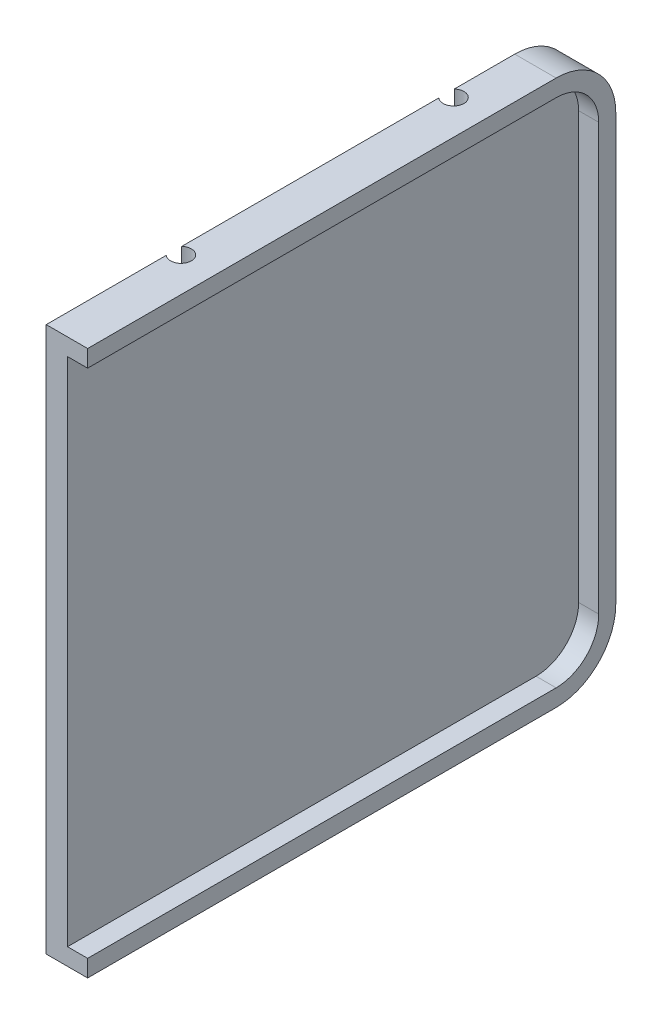
ISO-10303-21;
HEADER;
FILE_DESCRIPTION(('STEP AP214'),'2;1');
FILE_NAME('part.step','',(''),(''),'','','');
FILE_SCHEMA(('AUTOMOTIVE_DESIGN { 1 0 10303 214 1 1 1 1 }'));
ENDSEC;
DATA;
#1=APPLICATION_CONTEXT('core data for automotive mechanical design processes');
#2=APPLICATION_PROTOCOL_DEFINITION('international standard','automotive_design',2000,#1);
#3=PRODUCT_CONTEXT('',#1,'mechanical');
#4=PRODUCT('Part','Part','',(#3));
#5=PRODUCT_RELATED_PRODUCT_CATEGORY('part','',(#4));
#6=PRODUCT_DEFINITION_FORMATION('','',#4);
#7=PRODUCT_DEFINITION_CONTEXT('part definition',#1,'design');
#8=PRODUCT_DEFINITION('design','',#6,#7);
#9=PRODUCT_DEFINITION_SHAPE('','',#8);
#10=(LENGTH_UNIT() NAMED_UNIT(*) SI_UNIT(.MILLI.,.METRE.));
#11=(NAMED_UNIT(*) PLANE_ANGLE_UNIT() SI_UNIT($,.RADIAN.));
#12=(NAMED_UNIT(*) SI_UNIT($,.STERADIAN.) SOLID_ANGLE_UNIT());
#13=UNCERTAINTY_MEASURE_WITH_UNIT(LENGTH_MEASURE(1.E-05),#10,'distance_accuracy_value','');
#14=(GEOMETRIC_REPRESENTATION_CONTEXT(3) GLOBAL_UNCERTAINTY_ASSIGNED_CONTEXT((#13)) GLOBAL_UNIT_ASSIGNED_CONTEXT((#10,
#11,#12)) REPRESENTATION_CONTEXT('',''));
#15=CARTESIAN_POINT('',(0.,0.,0.));
#16=DIRECTION('',(0.,0.,1.));
#17=DIRECTION('',(1.,0.,0.));
#18=AXIS2_PLACEMENT_3D('',#15,#16,#17);
#19=CARTESIAN_POINT('',(31.9278,31.75,-184.15));
#20=DIRECTION('',(1.,0.,0.));
#21=DIRECTION('',(0.,0.,-1.));
#22=AXIS2_PLACEMENT_3D('',#19,#20,#21);
#23=PLANE('',#22);
#24=CARTESIAN_POINT('',(31.9278,-33.075,-186.69));
#25=DIRECTION('',(1.,0.,0.));
#26=DIRECTION('',(0.,0.,-1.));
#27=AXIS2_PLACEMENT_3D('',#24,#25,#26);
#28=CIRCLE('',#27,2.5);
#29=CARTESIAN_POINT('',(31.9278,-33.075,-189.19));
#30=VERTEX_POINT('',#29);
#31=EDGE_CURVE('E11',#30,#30,#28,.F.);
#32=ORIENTED_EDGE('',*,*,#31,.F.);
#33=EDGE_LOOP('',(#32));
#34=FACE_BOUND('',#33,.T.);
#35=CARTESIAN_POINT('',(31.9278,33.075,-186.69));
#36=DIRECTION('',(1.,0.,0.));
#37=DIRECTION('',(0.,0.,-1.));
#38=AXIS2_PLACEMENT_3D('',#35,#36,#37);
#39=CIRCLE('',#38,2.5);
#40=CARTESIAN_POINT('',(31.9278,33.075,-189.19));
#41=VERTEX_POINT('',#40);
#42=EDGE_CURVE('E61',#41,#41,#39,.F.);
#43=ORIENTED_EDGE('',*,*,#42,.F.);
#44=EDGE_LOOP('',(#43));
#45=FACE_BOUND('',#44,.T.);
#46=DIRECTION('',(0.,0.,1.));
#47=VECTOR('',#46,1.);
#48=CARTESIAN_POINT('',(31.9278,-40.64,-184.15));
#49=LINE('',#48,#47);
#50=CARTESIAN_POINT('',(31.9278,-40.64,-184.15));
#51=VERTEX_POINT('',#50);
#52=CARTESIAN_POINT('',(31.9278,-40.64,-175.137491176437));
#53=VERTEX_POINT('',#52);
#54=EDGE_CURVE('E189',#51,#53,#49,.T.);
#55=ORIENTED_EDGE('',*,*,#54,.T.);
#56=DIRECTION('',(0.,1.,0.));
#57=VECTOR('',#56,1.);
#58=CARTESIAN_POINT('',(31.9278,-40.64,-175.137491176437));
#59=LINE('',#58,#57);
#60=CARTESIAN_POINT('',(31.9278,40.64,-175.137491176437));
#61=VERTEX_POINT('',#60);
#62=EDGE_CURVE('E250',#53,#61,#59,.T.);
#63=ORIENTED_EDGE('',*,*,#62,.T.);
#64=DIRECTION('',(0.,0.,1.));
#65=VECTOR('',#64,1.);
#66=CARTESIAN_POINT('',(31.9278,40.64,-114.3));
#67=LINE('',#66,#65);
#68=CARTESIAN_POINT('',(31.9278,40.64,-184.15));
#69=VERTEX_POINT('',#68);
#70=EDGE_CURVE('E196',#61,#69,#67,.F.);
#71=ORIENTED_EDGE('',*,*,#70,.T.);
#72=CARTESIAN_POINT('',(31.9278,31.75,-184.15));
#73=DIRECTION('',(-1.,0.,0.));
#74=DIRECTION('',(0.,0.,1.));
#75=AXIS2_PLACEMENT_3D('',#72,#73,#74);
#76=CIRCLE('',#75,8.89000000000005);
#77=CARTESIAN_POINT('',(31.9278,31.75,-193.04));
#78=VERTEX_POINT('',#77);
#79=EDGE_CURVE('E413',#69,#78,#76,.T.);
#80=ORIENTED_EDGE('',*,*,#79,.T.);
#81=DIRECTION('',(0.,1.,0.));
#82=VECTOR('',#81,1.);
#83=CARTESIAN_POINT('',(31.9278,31.75,-193.04));
#84=LINE('',#83,#82);
#85=CARTESIAN_POINT('',(31.9278,-31.75,-193.04));
#86=VERTEX_POINT('',#85);
#87=EDGE_CURVE('E411',#78,#86,#84,.F.);
#88=ORIENTED_EDGE('',*,*,#87,.T.);
#89=CARTESIAN_POINT('',(31.9278,-31.75,-184.15));
#90=DIRECTION('',(-1.,0.,0.));
#91=DIRECTION('',(0.,0.,1.));
#92=AXIS2_PLACEMENT_3D('',#89,#90,#91);
#93=CIRCLE('',#92,8.89000000000005);
#94=EDGE_CURVE('E228',#86,#51,#93,.T.);
#95=ORIENTED_EDGE('',*,*,#94,.T.);
#96=EDGE_LOOP('',(#55,#63,#71,#80,#88,#95));
#97=FACE_BOUND('',#96,.T.);
#98=ADVANCED_FACE('F51',(#34,#45,#97),#23,.F.);
#99=CARTESIAN_POINT('',(31.9278,40.64,-134.497491176437));
#100=VERTEX_POINT('',#99);
#101=CARTESIAN_POINT('',(31.9278,40.64,-172.842508823563));
#102=VERTEX_POINT('',#101);
#103=EDGE_CURVE('E421',#100,#102,#67,.F.);
#104=ORIENTED_EDGE('',*,*,#103,.T.);
#105=DIRECTION('',(0.,1.,0.));
#106=VECTOR('',#105,1.);
#107=CARTESIAN_POINT('',(31.9278,-40.64,-172.842508823563));
#108=LINE('',#107,#106);
#109=CARTESIAN_POINT('',(31.9278,-40.64,-172.842508823563));
#110=VERTEX_POINT('',#109);
#111=EDGE_CURVE('E68',#102,#110,#108,.F.);
#112=ORIENTED_EDGE('',*,*,#111,.T.);
#113=CARTESIAN_POINT('',(31.9278,-40.64,-134.497491176437));
#114=VERTEX_POINT('',#113);
#115=EDGE_CURVE('E180',#110,#114,#49,.T.);
#116=ORIENTED_EDGE('',*,*,#115,.T.);
#117=DIRECTION('',(0.,1.,0.));
#118=VECTOR('',#117,1.);
#119=CARTESIAN_POINT('',(31.9278,-40.64,-134.497491176437));
#120=LINE('',#119,#118);
#121=EDGE_CURVE('E164',#114,#100,#120,.T.);
#122=ORIENTED_EDGE('',*,*,#121,.T.);
#123=EDGE_LOOP('',(#104,#112,#116,#122));
#124=FACE_BOUND('',#123,.T.);
#125=ADVANCED_FACE('F187',(#124),#23,.F.);
#126=CARTESIAN_POINT('',(31.9278,38.1,-114.3));
#127=DIRECTION('',(0.,0.,1.));
#128=DIRECTION('',(0.,-1.,0.));
#129=AXIS2_PLACEMENT_3D('',#126,#127,#128);
#130=PLANE('',#129);
#131=DIRECTION('',(0.,-1.,0.));
#132=VECTOR('',#131,1.);
#133=CARTESIAN_POINT('',(35.1028,38.1,-114.3));
#134=LINE('',#133,#132);
#135=CARTESIAN_POINT('',(35.1028,38.1,-114.3));
#136=VERTEX_POINT('',#135);
#137=CARTESIAN_POINT('',(35.1028,-38.1,-114.3));
#138=VERTEX_POINT('',#137);
#139=EDGE_CURVE('E297',#136,#138,#134,.T.);
#140=ORIENTED_EDGE('',*,*,#139,.F.);
#141=DIRECTION('',(-1.,0.,0.));
#142=VECTOR('',#141,1.);
#143=CARTESIAN_POINT('',(151.265480602523,38.1,-114.3));
#144=LINE('',#143,#142);
#145=CARTESIAN_POINT('',(38.1,38.1,-114.3));
#146=VERTEX_POINT('',#145);
#147=EDGE_CURVE('E268',#146,#136,#144,.T.);
#148=ORIENTED_EDGE('',*,*,#147,.F.);
#149=DIRECTION('',(0.,-1.,0.));
#150=VECTOR('',#149,1.);
#151=CARTESIAN_POINT('',(38.1,40.64,-114.3));
#152=LINE('',#151,#150);
#153=CARTESIAN_POINT('',(38.1,40.64,-114.3));
#154=VERTEX_POINT('',#153);
#155=EDGE_CURVE('E224',#154,#146,#152,.T.);
#156=ORIENTED_EDGE('',*,*,#155,.F.);
#157=DIRECTION('',(-1.,0.,0.));
#158=VECTOR('',#157,1.);
#159=CARTESIAN_POINT('',(151.265480602523,40.64,-114.3));
#160=LINE('',#159,#158);
#161=CARTESIAN_POINT('',(31.9278,40.64,-114.3));
#162=VERTEX_POINT('',#161);
#163=EDGE_CURVE('E264',#154,#162,#160,.T.);
#164=ORIENTED_EDGE('',*,*,#163,.T.);
#165=DIRECTION('',(0.,-1.,0.));
#166=VECTOR('',#165,1.);
#167=CARTESIAN_POINT('',(31.9278,38.1,-114.3));
#168=LINE('',#167,#166);
#169=CARTESIAN_POINT('',(31.9278,-40.64,-114.3));
#170=VERTEX_POINT('',#169);
#171=EDGE_CURVE('E293',#162,#170,#168,.T.);
#172=ORIENTED_EDGE('',*,*,#171,.T.);
#173=DIRECTION('',(-1.,0.,0.));
#174=VECTOR('',#173,1.);
#175=CARTESIAN_POINT('',(151.265480602523,-40.64,-114.3));
#176=LINE('',#175,#174);
#177=CARTESIAN_POINT('',(38.1,-40.64,-114.3));
#178=VERTEX_POINT('',#177);
#179=EDGE_CURVE('E245',#178,#170,#176,.T.);
#180=ORIENTED_EDGE('',*,*,#179,.F.);
#181=DIRECTION('',(0.,-1.,0.));
#182=VECTOR('',#181,1.);
#183=CARTESIAN_POINT('',(38.1,-38.1,-114.3));
#184=LINE('',#183,#182);
#185=CARTESIAN_POINT('',(38.1,-38.1,-114.3));
#186=VERTEX_POINT('',#185);
#187=EDGE_CURVE('E207',#186,#178,#184,.T.);
#188=ORIENTED_EDGE('',*,*,#187,.F.);
#189=DIRECTION('',(-1.,0.,0.));
#190=VECTOR('',#189,1.);
#191=CARTESIAN_POINT('',(151.265480602523,-38.1,-114.3));
#192=LINE('',#191,#190);
#193=EDGE_CURVE('E198',#186,#138,#192,.T.);
#194=ORIENTED_EDGE('',*,*,#193,.T.);
#195=EDGE_LOOP('',(#140,#148,#156,#164,#172,#180,#188,#194));
#196=FACE_BOUND('',#195,.T.);
#197=ADVANCED_FACE('F449',(#196),#130,.T.);
#198=CARTESIAN_POINT('',(31.9278,-33.075,-120.65));
#199=DIRECTION('',(1.,0.,0.));
#200=DIRECTION('',(0.,0.,-1.));
#201=AXIS2_PLACEMENT_3D('',#198,#199,#200);
#202=CIRCLE('',#201,2.50000000000001);
#203=CARTESIAN_POINT('',(31.9278,-33.075,-123.15));
#204=VERTEX_POINT('',#203);
#205=EDGE_CURVE('E373',#204,#204,#202,.F.);
#206=ORIENTED_EDGE('',*,*,#205,.F.);
#207=EDGE_LOOP('',(#206));
#208=FACE_BOUND('',#207,.T.);
#209=CARTESIAN_POINT('',(31.9278,33.075,-120.65));
#210=DIRECTION('',(1.,0.,0.));
#211=DIRECTION('',(0.,0.,-1.));
#212=AXIS2_PLACEMENT_3D('',#209,#210,#211);
#213=CIRCLE('',#212,2.5);
#214=CARTESIAN_POINT('',(31.9278,33.075,-123.15));
#215=VERTEX_POINT('',#214);
#216=EDGE_CURVE('E353',#215,#215,#213,.F.);
#217=ORIENTED_EDGE('',*,*,#216,.F.);
#218=EDGE_LOOP('',(#217));
#219=FACE_BOUND('',#218,.T.);
#220=CARTESIAN_POINT('',(31.9278,40.64,-132.202508823563));
#221=VERTEX_POINT('',#220);
#222=EDGE_CURVE('E201',#162,#221,#67,.F.);
#223=ORIENTED_EDGE('',*,*,#222,.T.);
#224=DIRECTION('',(0.,1.,0.));
#225=VECTOR('',#224,1.);
#226=CARTESIAN_POINT('',(31.9278,-40.64,-132.202508823563));
#227=LINE('',#226,#225);
#228=CARTESIAN_POINT('',(31.9278,-40.64,-132.202508823563));
#229=VERTEX_POINT('',#228);
#230=EDGE_CURVE('E76',#221,#229,#227,.F.);
#231=ORIENTED_EDGE('',*,*,#230,.T.);
#232=EDGE_CURVE('E182',#229,#170,#49,.T.);
#233=ORIENTED_EDGE('',*,*,#232,.T.);
#234=ORIENTED_EDGE('',*,*,#171,.F.);
#235=EDGE_LOOP('',(#223,#231,#233,#234));
#236=FACE_BOUND('',#235,.T.);
#237=ADVANCED_FACE('F388',(#208,#219,#236),#23,.F.);
#238=CARTESIAN_POINT('',(35.1028,31.75,-184.15));
#239=DIRECTION('',(1.,0.,0.));
#240=DIRECTION('',(0.,0.,-1.));
#241=AXIS2_PLACEMENT_3D('',#238,#239,#240);
#242=PLANE('',#241);
#243=DIRECTION('',(0.,0.,-1.));
#244=VECTOR('',#243,1.);
#245=CARTESIAN_POINT('',(35.1028,38.1,-114.3));
#246=LINE('',#245,#244);
#247=CARTESIAN_POINT('',(35.1028,38.1,-184.15));
#248=VERTEX_POINT('',#247);
#249=EDGE_CURVE('E254',#136,#248,#246,.T.);
#250=ORIENTED_EDGE('',*,*,#249,.F.);
#251=ORIENTED_EDGE('',*,*,#139,.T.);
#252=DIRECTION('',(0.,0.,1.));
#253=VECTOR('',#252,1.);
#254=CARTESIAN_POINT('',(35.1028,-38.1,-184.15));
#255=LINE('',#254,#253);
#256=CARTESIAN_POINT('',(35.1028,-38.1,-184.15));
#257=VERTEX_POINT('',#256);
#258=EDGE_CURVE('E311',#257,#138,#255,.T.);
#259=ORIENTED_EDGE('',*,*,#258,.F.);
#260=CARTESIAN_POINT('',(35.1028,-31.75,-184.15));
#261=DIRECTION('',(-1.,0.,0.));
#262=DIRECTION('',(0.,0.,1.));
#263=AXIS2_PLACEMENT_3D('',#260,#261,#262);
#264=CIRCLE('',#263,6.35000000000004);
#265=CARTESIAN_POINT('',(35.1028,-31.75,-190.5));
#266=VERTEX_POINT('',#265);
#267=EDGE_CURVE('E307',#266,#257,#264,.T.);
#268=ORIENTED_EDGE('',*,*,#267,.F.);
#269=DIRECTION('',(0.,-1.,0.));
#270=VECTOR('',#269,1.);
#271=CARTESIAN_POINT('',(35.1028,31.75,-190.5));
#272=LINE('',#271,#270);
#273=CARTESIAN_POINT('',(35.1028,31.75,-190.5));
#274=VERTEX_POINT('',#273);
#275=EDGE_CURVE('E303',#274,#266,#272,.T.);
#276=ORIENTED_EDGE('',*,*,#275,.F.);
#277=CARTESIAN_POINT('',(35.1028,31.75,-184.15));
#278=DIRECTION('',(1.,0.,0.));
#279=DIRECTION('',(0.,0.,-1.));
#280=AXIS2_PLACEMENT_3D('',#277,#278,#279);
#281=CIRCLE('',#280,6.35000000000005);
#282=EDGE_CURVE('E300',#274,#248,#281,.T.);
#283=ORIENTED_EDGE('',*,*,#282,.T.);
#284=EDGE_LOOP('',(#250,#251,#259,#268,#276,#283));
#285=FACE_BOUND('',#284,.T.);
#286=ADVANCED_FACE('F451',(#285),#242,.T.);
#287=CARTESIAN_POINT('',(151.265480602523,-40.64,-184.15));
#288=DIRECTION('',(0.,-1.,0.));
#289=DIRECTION('',(0.,0.,-1.));
#290=AXIS2_PLACEMENT_3D('',#287,#288,#289);
#291=PLANE('',#290);
#292=CARTESIAN_POINT('',(32.9698,-40.64,-173.99));
#293=DIRECTION('',(0.,1.,0.));
#294=DIRECTION('',(0.,0.,1.));
#295=AXIS2_PLACEMENT_3D('',#292,#293,#294);
#296=CIRCLE('',#295,1.55);
#297=EDGE_CURVE('E184',#110,#53,#296,.T.);
#298=ORIENTED_EDGE('',*,*,#297,.T.);
#299=ORIENTED_EDGE('',*,*,#54,.F.);
#300=DIRECTION('',(-1.,0.,0.));
#301=VECTOR('',#300,1.);
#302=CARTESIAN_POINT('',(151.265480602523,-40.64,-184.15));
#303=LINE('',#302,#301);
#304=CARTESIAN_POINT('',(38.1,-40.64,-184.15));
#305=VERTEX_POINT('',#304);
#306=EDGE_CURVE('E241',#305,#51,#303,.T.);
#307=ORIENTED_EDGE('',*,*,#306,.F.);
#308=DIRECTION('',(0.,0.,1.));
#309=VECTOR('',#308,1.);
#310=CARTESIAN_POINT('',(38.1,-40.64,-184.15));
#311=LINE('',#310,#309);
#312=EDGE_CURVE('E246',#305,#178,#311,.T.);
#313=ORIENTED_EDGE('',*,*,#312,.T.);
#314=ORIENTED_EDGE('',*,*,#179,.T.);
#315=ORIENTED_EDGE('',*,*,#232,.F.);
#316=CARTESIAN_POINT('',(32.9698,-40.64,-133.35));
#317=DIRECTION('',(0.,1.,0.));
#318=DIRECTION('',(0.,0.,1.));
#319=AXIS2_PLACEMENT_3D('',#316,#317,#318);
#320=CIRCLE('',#319,1.55);
#321=EDGE_CURVE('E167',#229,#114,#320,.T.);
#322=ORIENTED_EDGE('',*,*,#321,.T.);
#323=ORIENTED_EDGE('',*,*,#115,.F.);
#324=EDGE_LOOP('',(#298,#299,#307,#313,#314,#315,#322,#323));
#325=FACE_BOUND('',#324,.T.);
#326=ADVANCED_FACE('F179',(#325),#291,.T.);
#327=CARTESIAN_POINT('',(151.265480602523,-31.75,-184.15));
#328=DIRECTION('',(-1.,0.,0.));
#329=DIRECTION('',(0.,0.,1.));
#330=AXIS2_PLACEMENT_3D('',#327,#328,#329);
#331=CYLINDRICAL_SURFACE('',#330,8.89000000000005);
#332=DIRECTION('',(-1.,0.,0.));
#333=VECTOR('',#332,1.);
#334=CARTESIAN_POINT('',(151.265480602523,-31.75,-193.04));
#335=LINE('',#334,#333);
#336=CARTESIAN_POINT('',(38.1,-31.75,-193.04));
#337=VERTEX_POINT('',#336);
#338=EDGE_CURVE('E237',#337,#86,#335,.T.);
#339=ORIENTED_EDGE('',*,*,#338,.F.);
#340=CARTESIAN_POINT('',(38.1,-31.75,-184.15));
#341=DIRECTION('',(1.,0.,0.));
#342=DIRECTION('',(0.,0.,-1.));
#343=AXIS2_PLACEMENT_3D('',#340,#341,#342);
#344=CIRCLE('',#343,8.89000000000005);
#345=EDGE_CURVE('E242',#337,#305,#344,.F.);
#346=ORIENTED_EDGE('',*,*,#345,.T.);
#347=ORIENTED_EDGE('',*,*,#306,.T.);
#348=ORIENTED_EDGE('',*,*,#94,.F.);
#349=EDGE_LOOP('',(#339,#346,#347,#348));
#350=FACE_BOUND('',#349,.T.);
#351=ADVANCED_FACE('F442',(#350),#331,.T.);
#352=CARTESIAN_POINT('',(151.265480602523,31.75,-193.04));
#353=DIRECTION('',(0.,0.,-1.));
#354=DIRECTION('',(-1.,0.,0.));
#355=AXIS2_PLACEMENT_3D('',#352,#353,#354);
#356=PLANE('',#355);
#357=DIRECTION('',(-1.,0.,0.));
#358=VECTOR('',#357,1.);
#359=CARTESIAN_POINT('',(151.265480602523,31.75,-193.04));
#360=LINE('',#359,#358);
#361=CARTESIAN_POINT('',(38.1,31.75,-193.04));
#362=VERTEX_POINT('',#361);
#363=EDGE_CURVE('E233',#362,#78,#360,.T.);
#364=ORIENTED_EDGE('',*,*,#363,.F.);
#365=DIRECTION('',(0.,-1.,0.));
#366=VECTOR('',#365,1.);
#367=CARTESIAN_POINT('',(38.1,31.75,-193.04));
#368=LINE('',#367,#366);
#369=EDGE_CURVE('E238',#362,#337,#368,.T.);
#370=ORIENTED_EDGE('',*,*,#369,.T.);
#371=ORIENTED_EDGE('',*,*,#338,.T.);
#372=ORIENTED_EDGE('',*,*,#87,.F.);
#373=EDGE_LOOP('',(#364,#370,#371,#372));
#374=FACE_BOUND('',#373,.T.);
#375=ADVANCED_FACE('F439',(#374),#356,.T.);
#376=CARTESIAN_POINT('',(151.265480602523,31.75,-184.15));
#377=DIRECTION('',(-1.,0.,0.));
#378=DIRECTION('',(0.,0.,1.));
#379=AXIS2_PLACEMENT_3D('',#376,#377,#378);
#380=CYLINDRICAL_SURFACE('',#379,8.89000000000005);
#381=DIRECTION('',(-1.,0.,0.));
#382=VECTOR('',#381,1.);
#383=CARTESIAN_POINT('',(151.265480602523,40.64,-184.15));
#384=LINE('',#383,#382);
#385=CARTESIAN_POINT('',(38.1,40.64,-184.15));
#386=VERTEX_POINT('',#385);
#387=EDGE_CURVE('E232',#386,#69,#384,.T.);
#388=ORIENTED_EDGE('',*,*,#387,.F.);
#389=CARTESIAN_POINT('',(38.1,31.75,-184.15));
#390=DIRECTION('',(1.,0.,0.));
#391=DIRECTION('',(0.,0.,-1.));
#392=AXIS2_PLACEMENT_3D('',#389,#390,#391);
#393=CIRCLE('',#392,8.89000000000005);
#394=EDGE_CURVE('E234',#386,#362,#393,.F.);
#395=ORIENTED_EDGE('',*,*,#394,.T.);
#396=ORIENTED_EDGE('',*,*,#363,.T.);
#397=ORIENTED_EDGE('',*,*,#79,.F.);
#398=EDGE_LOOP('',(#388,#395,#396,#397));
#399=FACE_BOUND('',#398,.T.);
#400=ADVANCED_FACE('F434',(#399),#380,.T.);
#401=CARTESIAN_POINT('',(151.265480602523,40.64,-114.3));
#402=DIRECTION('',(0.,1.,0.));
#403=DIRECTION('',(0.,0.,1.));
#404=AXIS2_PLACEMENT_3D('',#401,#402,#403);
#405=PLANE('',#404);
#406=CARTESIAN_POINT('',(32.9698,40.64,-173.99));
#407=DIRECTION('',(0.,1.,0.));
#408=DIRECTION('',(0.,0.,1.));
#409=AXIS2_PLACEMENT_3D('',#406,#407,#408);
#410=CIRCLE('',#409,1.55);
#411=EDGE_CURVE('E319',#102,#61,#410,.T.);
#412=ORIENTED_EDGE('',*,*,#411,.F.);
#413=ORIENTED_EDGE('',*,*,#103,.F.);
#414=CARTESIAN_POINT('',(32.9698,40.64,-133.35));
#415=DIRECTION('',(0.,1.,0.));
#416=DIRECTION('',(0.,0.,1.));
#417=AXIS2_PLACEMENT_3D('',#414,#415,#416);
#418=CIRCLE('',#417,1.55);
#419=EDGE_CURVE('E168',#221,#100,#418,.T.);
#420=ORIENTED_EDGE('',*,*,#419,.F.);
#421=ORIENTED_EDGE('',*,*,#222,.F.);
#422=ORIENTED_EDGE('',*,*,#163,.F.);
#423=DIRECTION('',(0.,0.,-1.));
#424=VECTOR('',#423,1.);
#425=CARTESIAN_POINT('',(38.1,40.64,-114.3));
#426=LINE('',#425,#424);
#427=EDGE_CURVE('E229',#154,#386,#426,.T.);
#428=ORIENTED_EDGE('',*,*,#427,.T.);
#429=ORIENTED_EDGE('',*,*,#387,.T.);
#430=ORIENTED_EDGE('',*,*,#70,.F.);
#431=EDGE_LOOP('',(#412,#413,#420,#421,#422,#428,#429,#430));
#432=FACE_BOUND('',#431,.T.);
#433=ADVANCED_FACE('F429',(#432),#405,.T.);
#434=CARTESIAN_POINT('',(151.265480602523,38.1,-114.3));
#435=DIRECTION('',(0.,1.,0.));
#436=DIRECTION('',(0.,0.,1.));
#437=AXIS2_PLACEMENT_3D('',#434,#435,#436);
#438=PLANE('',#437);
#439=ORIENTED_EDGE('',*,*,#249,.T.);
#440=DIRECTION('',(-1.,0.,0.));
#441=VECTOR('',#440,1.);
#442=CARTESIAN_POINT('',(151.265480602523,38.1,-184.15));
#443=LINE('',#442,#441);
#444=CARTESIAN_POINT('',(38.1,38.1,-184.15));
#445=VERTEX_POINT('',#444);
#446=EDGE_CURVE('E272',#445,#248,#443,.T.);
#447=ORIENTED_EDGE('',*,*,#446,.F.);
#448=DIRECTION('',(0.,0.,-1.));
#449=VECTOR('',#448,1.);
#450=CARTESIAN_POINT('',(38.1,38.1,-114.3));
#451=LINE('',#450,#449);
#452=EDGE_CURVE('E220',#146,#445,#451,.T.);
#453=ORIENTED_EDGE('',*,*,#452,.F.);
#454=ORIENTED_EDGE('',*,*,#147,.T.);
#455=EDGE_LOOP('',(#439,#447,#453,#454));
#456=FACE_BOUND('',#455,.T.);
#457=ADVANCED_FACE('F512',(#456),#438,.F.);
#458=CARTESIAN_POINT('',(151.265480602523,31.75,-184.15));
#459=DIRECTION('',(-1.,0.,0.));
#460=DIRECTION('',(0.,0.,1.));
#461=AXIS2_PLACEMENT_3D('',#458,#459,#460);
#462=CYLINDRICAL_SURFACE('',#461,6.35000000000005);
#463=ORIENTED_EDGE('',*,*,#282,.F.);
#464=DIRECTION('',(-1.,0.,0.));
#465=VECTOR('',#464,1.);
#466=CARTESIAN_POINT('',(151.265480602523,31.75,-190.5));
#467=LINE('',#466,#465);
#468=CARTESIAN_POINT('',(38.1,31.75,-190.5));
#469=VERTEX_POINT('',#468);
#470=EDGE_CURVE('E276',#469,#274,#467,.T.);
#471=ORIENTED_EDGE('',*,*,#470,.F.);
#472=CARTESIAN_POINT('',(38.1,31.75,-184.15));
#473=DIRECTION('',(1.,0.,0.));
#474=DIRECTION('',(0.,0.,-1.));
#475=AXIS2_PLACEMENT_3D('',#472,#473,#474);
#476=CIRCLE('',#475,6.35000000000005);
#477=EDGE_CURVE('E216',#445,#469,#476,.F.);
#478=ORIENTED_EDGE('',*,*,#477,.F.);
#479=ORIENTED_EDGE('',*,*,#446,.T.);
#480=EDGE_LOOP('',(#463,#471,#478,#479));
#481=FACE_BOUND('',#480,.T.);
#482=ADVANCED_FACE('F517',(#481),#462,.F.);
#483=CARTESIAN_POINT('',(151.265480602523,31.75,-190.5));
#484=DIRECTION('',(0.,0.,-1.));
#485=DIRECTION('',(-1.,0.,0.));
#486=AXIS2_PLACEMENT_3D('',#483,#484,#485);
#487=PLANE('',#486);
#488=ORIENTED_EDGE('',*,*,#275,.T.);
#489=DIRECTION('',(-1.,0.,0.));
#490=VECTOR('',#489,1.);
#491=CARTESIAN_POINT('',(151.265480602523,-31.75,-190.5));
#492=LINE('',#491,#490);
#493=CARTESIAN_POINT('',(38.1,-31.75,-190.5));
#494=VERTEX_POINT('',#493);
#495=EDGE_CURVE('E280',#494,#266,#492,.T.);
#496=ORIENTED_EDGE('',*,*,#495,.F.);
#497=DIRECTION('',(0.,-1.,0.));
#498=VECTOR('',#497,1.);
#499=CARTESIAN_POINT('',(38.1,31.75,-190.5));
#500=LINE('',#499,#498);
#501=EDGE_CURVE('E212',#469,#494,#500,.T.);
#502=ORIENTED_EDGE('',*,*,#501,.F.);
#503=ORIENTED_EDGE('',*,*,#470,.T.);
#504=EDGE_LOOP('',(#488,#496,#502,#503));
#505=FACE_BOUND('',#504,.T.);
#506=ADVANCED_FACE('F527',(#505),#487,.F.);
#507=CARTESIAN_POINT('',(151.265480602523,-31.75,-184.15));
#508=DIRECTION('',(-1.,0.,0.));
#509=DIRECTION('',(0.,0.,1.));
#510=AXIS2_PLACEMENT_3D('',#507,#508,#509);
#511=CYLINDRICAL_SURFACE('',#510,6.35000000000005);
#512=ORIENTED_EDGE('',*,*,#267,.T.);
#513=DIRECTION('',(-1.,0.,0.));
#514=VECTOR('',#513,1.);
#515=CARTESIAN_POINT('',(151.265480602523,-38.1,-184.15));
#516=LINE('',#515,#514);
#517=CARTESIAN_POINT('',(38.1,-38.1,-184.15));
#518=VERTEX_POINT('',#517);
#519=EDGE_CURVE('E284',#518,#257,#516,.T.);
#520=ORIENTED_EDGE('',*,*,#519,.F.);
#521=CARTESIAN_POINT('',(38.1,-31.75,-184.15));
#522=DIRECTION('',(1.,0.,0.));
#523=DIRECTION('',(0.,0.,-1.));
#524=AXIS2_PLACEMENT_3D('',#521,#522,#523);
#525=CIRCLE('',#524,6.35000000000005);
#526=EDGE_CURVE('E208',#494,#518,#525,.F.);
#527=ORIENTED_EDGE('',*,*,#526,.F.);
#528=ORIENTED_EDGE('',*,*,#495,.T.);
#529=EDGE_LOOP('',(#512,#520,#527,#528));
#530=FACE_BOUND('',#529,.T.);
#531=ADVANCED_FACE('F537',(#530),#511,.F.);
#532=CARTESIAN_POINT('',(151.265480602523,-38.1,-184.15));
#533=DIRECTION('',(0.,-1.,0.));
#534=DIRECTION('',(0.,0.,-1.));
#535=AXIS2_PLACEMENT_3D('',#532,#533,#534);
#536=PLANE('',#535);
#537=ORIENTED_EDGE('',*,*,#258,.T.);
#538=ORIENTED_EDGE('',*,*,#193,.F.);
#539=DIRECTION('',(0.,0.,1.));
#540=VECTOR('',#539,1.);
#541=CARTESIAN_POINT('',(38.1,-38.1,-184.15));
#542=LINE('',#541,#540);
#543=EDGE_CURVE('E203',#518,#186,#542,.T.);
#544=ORIENTED_EDGE('',*,*,#543,.F.);
#545=ORIENTED_EDGE('',*,*,#519,.T.);
#546=EDGE_LOOP('',(#537,#538,#544,#545));
#547=FACE_BOUND('',#546,.T.);
#548=ADVANCED_FACE('F547',(#547),#536,.F.);
#549=CARTESIAN_POINT('',(38.1,-31.75,184.15));
#550=DIRECTION('',(1.,0.,0.));
#551=DIRECTION('',(0.,0.,-1.));
#552=AXIS2_PLACEMENT_3D('',#549,#550,#551);
#553=PLANE('',#552);
#554=ORIENTED_EDGE('',*,*,#312,.F.);
#555=ORIENTED_EDGE('',*,*,#345,.F.);
#556=ORIENTED_EDGE('',*,*,#369,.F.);
#557=ORIENTED_EDGE('',*,*,#394,.F.);
#558=ORIENTED_EDGE('',*,*,#427,.F.);
#559=ORIENTED_EDGE('',*,*,#155,.T.);
#560=ORIENTED_EDGE('',*,*,#452,.T.);
#561=ORIENTED_EDGE('',*,*,#477,.T.);
#562=ORIENTED_EDGE('',*,*,#501,.T.);
#563=ORIENTED_EDGE('',*,*,#526,.T.);
#564=ORIENTED_EDGE('',*,*,#543,.T.);
#565=ORIENTED_EDGE('',*,*,#187,.T.);
#566=EDGE_LOOP('',(#554,#555,#556,#557,#558,#559,#560,#561,#562,#563,#564,#565));
#567=FACE_BOUND('',#566,.T.);
#568=ADVANCED_FACE('F445',(#567),#553,.T.);
#569=CARTESIAN_POINT('',(32.9698,-40.64,-133.35));
#570=DIRECTION('',(0.,1.,0.));
#571=DIRECTION('',(0.,0.,1.));
#572=AXIS2_PLACEMENT_3D('',#569,#570,#571);
#573=CYLINDRICAL_SURFACE('',#572,1.55);
#574=ORIENTED_EDGE('',*,*,#321,.F.);
#575=ORIENTED_EDGE('',*,*,#230,.F.);
#576=ORIENTED_EDGE('',*,*,#419,.T.);
#577=ORIENTED_EDGE('',*,*,#121,.F.);
#578=EDGE_LOOP('',(#574,#575,#576,#577));
#579=FACE_BOUND('',#578,.T.);
#580=ADVANCED_FACE('F166',(#579),#573,.F.);
#581=CARTESIAN_POINT('',(32.9698,-40.64,-173.99));
#582=DIRECTION('',(0.,1.,0.));
#583=DIRECTION('',(0.,0.,1.));
#584=AXIS2_PLACEMENT_3D('',#581,#582,#583);
#585=CYLINDRICAL_SURFACE('',#584,1.55);
#586=ORIENTED_EDGE('',*,*,#297,.F.);
#587=ORIENTED_EDGE('',*,*,#111,.F.);
#588=ORIENTED_EDGE('',*,*,#411,.T.);
#589=ORIENTED_EDGE('',*,*,#62,.F.);
#590=EDGE_LOOP('',(#586,#587,#588,#589));
#591=FACE_BOUND('',#590,.T.);
#592=ADVANCED_FACE('F571',(#591),#585,.F.);
#593=CARTESIAN_POINT('',(31.6738,-33.075,-186.69));
#594=DIRECTION('',(1.,0.,0.));
#595=DIRECTION('',(0.,0.,-1.));
#596=AXIS2_PLACEMENT_3D('',#593,#594,#595);
#597=CYLINDRICAL_SURFACE('',#596,2.5);
#598=CARTESIAN_POINT('',(31.6738,-33.075,-186.69));
#599=DIRECTION('',(-1.,0.,0.));
#600=DIRECTION('',(0.,0.,1.));
#601=AXIS2_PLACEMENT_3D('',#598,#599,#600);
#602=CIRCLE('',#601,2.5);
#603=CARTESIAN_POINT('',(31.6738,-33.075,-184.19));
#604=VERTEX_POINT('',#603);
#605=EDGE_CURVE('E875',#604,#604,#602,.T.);
#606=ORIENTED_EDGE('',*,*,#605,.F.);
#607=EDGE_LOOP('',(#606));
#608=FACE_BOUND('',#607,.T.);
#609=ORIENTED_EDGE('',*,*,#31,.T.);
#610=EDGE_LOOP('',(#609));
#611=FACE_BOUND('',#610,.T.);
#612=ADVANCED_FACE('F578',(#608,#611),#597,.T.);
#613=CARTESIAN_POINT('',(31.6738,-33.075,-186.69));
#614=DIRECTION('',(-1.,0.,0.));
#615=DIRECTION('',(0.,0.,1.));
#616=AXIS2_PLACEMENT_3D('',#613,#614,#615);
#617=PLANE('',#616);
#618=CARTESIAN_POINT('',(31.6738,-33.075,-186.69));
#619=DIRECTION('',(-1.,0.,0.));
#620=DIRECTION('',(0.,0.,1.));
#621=AXIS2_PLACEMENT_3D('',#618,#619,#620);
#622=CIRCLE('',#621,1.47500000000001);
#623=CARTESIAN_POINT('',(31.6738,-33.075,-185.215));
#624=VERTEX_POINT('',#623);
#625=EDGE_CURVE('E354',#624,#624,#622,.T.);
#626=ORIENTED_EDGE('',*,*,#625,.F.);
#627=EDGE_LOOP('',(#626));
#628=FACE_BOUND('',#627,.T.);
#629=ORIENTED_EDGE('',*,*,#605,.T.);
#630=EDGE_LOOP('',(#629));
#631=FACE_BOUND('',#630,.T.);
#632=ADVANCED_FACE('F585',(#628,#631),#617,.T.);
#633=CARTESIAN_POINT('',(31.6738,-33.075,-120.65));
#634=DIRECTION('',(1.,0.,0.));
#635=DIRECTION('',(0.,0.,-1.));
#636=AXIS2_PLACEMENT_3D('',#633,#634,#635);
#637=CYLINDRICAL_SURFACE('',#636,2.50000000000001);
#638=CARTESIAN_POINT('',(31.6738,-33.075,-120.65));
#639=DIRECTION('',(-1.,0.,0.));
#640=DIRECTION('',(0.,0.,1.));
#641=AXIS2_PLACEMENT_3D('',#638,#639,#640);
#642=CIRCLE('',#641,2.50000000000001);
#643=CARTESIAN_POINT('',(31.6738,-33.075,-118.15));
#644=VERTEX_POINT('',#643);
#645=EDGE_CURVE('E867',#644,#644,#642,.T.);
#646=ORIENTED_EDGE('',*,*,#645,.F.);
#647=EDGE_LOOP('',(#646));
#648=FACE_BOUND('',#647,.T.);
#649=ORIENTED_EDGE('',*,*,#205,.T.);
#650=EDGE_LOOP('',(#649));
#651=FACE_BOUND('',#650,.T.);
#652=ADVANCED_FACE('F592',(#648,#651),#637,.T.);
#653=CARTESIAN_POINT('',(31.6738,-33.075,-120.65));
#654=DIRECTION('',(-1.,0.,0.));
#655=DIRECTION('',(0.,0.,1.));
#656=AXIS2_PLACEMENT_3D('',#653,#654,#655);
#657=PLANE('',#656);
#658=CARTESIAN_POINT('',(31.6738,-33.075,-120.65));
#659=DIRECTION('',(-1.,0.,0.));
#660=DIRECTION('',(0.,0.,1.));
#661=AXIS2_PLACEMENT_3D('',#658,#659,#660);
#662=CIRCLE('',#661,1.47499999999999);
#663=CARTESIAN_POINT('',(31.6738,-33.075,-119.175));
#664=VERTEX_POINT('',#663);
#665=EDGE_CURVE('E358',#664,#664,#662,.T.);
#666=ORIENTED_EDGE('',*,*,#665,.F.);
#667=EDGE_LOOP('',(#666));
#668=FACE_BOUND('',#667,.T.);
#669=ORIENTED_EDGE('',*,*,#645,.T.);
#670=EDGE_LOOP('',(#669));
#671=FACE_BOUND('',#670,.T.);
#672=ADVANCED_FACE('F599',(#668,#671),#657,.T.);
#673=CARTESIAN_POINT('',(31.6738,33.075,-120.65));
#674=DIRECTION('',(1.,0.,0.));
#675=DIRECTION('',(0.,0.,-1.));
#676=AXIS2_PLACEMENT_3D('',#673,#674,#675);
#677=CYLINDRICAL_SURFACE('',#676,2.5);
#678=CARTESIAN_POINT('',(31.6738,33.075,-120.65));
#679=DIRECTION('',(-1.,0.,0.));
#680=DIRECTION('',(0.,0.,1.));
#681=AXIS2_PLACEMENT_3D('',#678,#679,#680);
#682=CIRCLE('',#681,2.5);
#683=CARTESIAN_POINT('',(31.6738,33.075,-118.15));
#684=VERTEX_POINT('',#683);
#685=EDGE_CURVE('E864',#684,#684,#682,.T.);
#686=ORIENTED_EDGE('',*,*,#685,.F.);
#687=EDGE_LOOP('',(#686));
#688=FACE_BOUND('',#687,.T.);
#689=ORIENTED_EDGE('',*,*,#216,.T.);
#690=EDGE_LOOP('',(#689));
#691=FACE_BOUND('',#690,.T.);
#692=ADVANCED_FACE('F606',(#688,#691),#677,.T.);
#693=CARTESIAN_POINT('',(31.6738,33.075,-120.65));
#694=DIRECTION('',(-1.,0.,0.));
#695=DIRECTION('',(0.,0.,1.));
#696=AXIS2_PLACEMENT_3D('',#693,#694,#695);
#697=PLANE('',#696);
#698=CARTESIAN_POINT('',(31.6738,33.075,-120.65));
#699=DIRECTION('',(-1.,0.,0.));
#700=DIRECTION('',(0.,0.,1.));
#701=AXIS2_PLACEMENT_3D('',#698,#699,#700);
#702=CIRCLE('',#701,1.475);
#703=CARTESIAN_POINT('',(31.6738,33.075,-119.175));
#704=VERTEX_POINT('',#703);
#705=EDGE_CURVE('E363',#704,#704,#702,.T.);
#706=ORIENTED_EDGE('',*,*,#705,.F.);
#707=EDGE_LOOP('',(#706));
#708=FACE_BOUND('',#707,.T.);
#709=ORIENTED_EDGE('',*,*,#685,.T.);
#710=EDGE_LOOP('',(#709));
#711=FACE_BOUND('',#710,.T.);
#712=ADVANCED_FACE('F613',(#708,#711),#697,.T.);
#713=CARTESIAN_POINT('',(31.6738,33.075,-186.69));
#714=DIRECTION('',(1.,0.,0.));
#715=DIRECTION('',(0.,0.,-1.));
#716=AXIS2_PLACEMENT_3D('',#713,#714,#715);
#717=CYLINDRICAL_SURFACE('',#716,2.5);
#718=CARTESIAN_POINT('',(31.6738,33.075,-186.69));
#719=DIRECTION('',(-1.,0.,0.));
#720=DIRECTION('',(0.,0.,1.));
#721=AXIS2_PLACEMENT_3D('',#718,#719,#720);
#722=CIRCLE('',#721,2.5);
#723=CARTESIAN_POINT('',(31.6738,33.075,-184.19));
#724=VERTEX_POINT('',#723);
#725=EDGE_CURVE('E359',#724,#724,#722,.T.);
#726=ORIENTED_EDGE('',*,*,#725,.F.);
#727=EDGE_LOOP('',(#726));
#728=FACE_BOUND('',#727,.T.);
#729=ORIENTED_EDGE('',*,*,#42,.T.);
#730=EDGE_LOOP('',(#729));
#731=FACE_BOUND('',#730,.T.);
#732=ADVANCED_FACE('F382',(#728,#731),#717,.T.);
#733=CARTESIAN_POINT('',(31.6738,33.075,-186.69));
#734=DIRECTION('',(-1.,0.,0.));
#735=DIRECTION('',(0.,0.,1.));
#736=AXIS2_PLACEMENT_3D('',#733,#734,#735);
#737=PLANE('',#736);
#738=CARTESIAN_POINT('',(31.6738,33.075,-186.69));
#739=DIRECTION('',(-1.,0.,0.));
#740=DIRECTION('',(0.,0.,1.));
#741=AXIS2_PLACEMENT_3D('',#738,#739,#740);
#742=CIRCLE('',#741,1.47500000000001);
#743=CARTESIAN_POINT('',(31.6738,33.075,-185.215));
#744=VERTEX_POINT('',#743);
#745=EDGE_CURVE('E185',#744,#744,#742,.T.);
#746=ORIENTED_EDGE('',*,*,#745,.F.);
#747=EDGE_LOOP('',(#746));
#748=FACE_BOUND('',#747,.T.);
#749=ORIENTED_EDGE('',*,*,#725,.T.);
#750=EDGE_LOOP('',(#749));
#751=FACE_BOUND('',#750,.T.);
#752=ADVANCED_FACE('F626',(#748,#751),#737,.T.);
#753=CARTESIAN_POINT('',(26.9278,-33.075,-186.69));
#754=DIRECTION('',(1.,0.,0.));
#755=DIRECTION('',(0.,0.,-1.));
#756=AXIS2_PLACEMENT_3D('',#753,#754,#755);
#757=PLANE('',#756);
#758=CARTESIAN_POINT('',(26.9278,-33.075,-186.69));
#759=DIRECTION('',(1.,0.,0.));
#760=DIRECTION('',(0.,0.,-1.));
#761=AXIS2_PLACEMENT_3D('',#758,#759,#760);
#762=CIRCLE('',#761,0.967000000000023);
#763=CARTESIAN_POINT('',(26.9278,-33.075,-187.657));
#764=VERTEX_POINT('',#763);
#765=EDGE_CURVE('E322',#764,#764,#762,.F.);
#766=ORIENTED_EDGE('',*,*,#765,.T.);
#767=EDGE_LOOP('',(#766));
#768=FACE_BOUND('',#767,.T.);
#769=ADVANCED_FACE('F633',(#768),#757,.F.);
#770=CARTESIAN_POINT('',(26.9278,-33.075,-186.69));
#771=DIRECTION('',(1.,0.,0.));
#772=DIRECTION('',(0.,0.,-1.));
#773=AXIS2_PLACEMENT_3D('',#770,#771,#772);
#774=CONICAL_SURFACE('',#773,0.967000000000023,0.785398163397426);
#775=CARTESIAN_POINT('',(27.4358,-33.075,-186.69));
#776=DIRECTION('',(1.,0.,0.));
#777=DIRECTION('',(0.,0.,-1.));
#778=AXIS2_PLACEMENT_3D('',#775,#776,#777);
#779=CIRCLE('',#778,1.47500000000001);
#780=CARTESIAN_POINT('',(27.4358,-33.075,-188.165));
#781=VERTEX_POINT('',#780);
#782=EDGE_CURVE('E326',#781,#781,#779,.T.);
#783=ORIENTED_EDGE('',*,*,#782,.F.);
#784=EDGE_LOOP('',(#783));
#785=FACE_BOUND('',#784,.T.);
#786=ORIENTED_EDGE('',*,*,#765,.F.);
#787=EDGE_LOOP('',(#786));
#788=FACE_BOUND('',#787,.T.);
#789=ADVANCED_FACE('F641',(#785,#788),#774,.T.);
#790=CARTESIAN_POINT('',(26.9278,-33.075,-186.69));
#791=DIRECTION('',(1.,0.,0.));
#792=DIRECTION('',(0.,0.,-1.));
#793=AXIS2_PLACEMENT_3D('',#790,#791,#792);
#794=CYLINDRICAL_SURFACE('',#793,1.47500000000001);
#795=ORIENTED_EDGE('',*,*,#625,.T.);
#796=EDGE_LOOP('',(#795));
#797=FACE_BOUND('',#796,.T.);
#798=ORIENTED_EDGE('',*,*,#782,.T.);
#799=EDGE_LOOP('',(#798));
#800=FACE_BOUND('',#799,.T.);
#801=ADVANCED_FACE('F649',(#797,#800),#794,.T.);
#802=CARTESIAN_POINT('',(26.9278,-33.075,-120.65));
#803=DIRECTION('',(1.,0.,0.));
#804=DIRECTION('',(0.,0.,-1.));
#805=AXIS2_PLACEMENT_3D('',#802,#803,#804);
#806=PLANE('',#805);
#807=CARTESIAN_POINT('',(26.9278,-33.075,-120.65));
#808=DIRECTION('',(1.,0.,0.));
#809=DIRECTION('',(0.,0.,-1.));
#810=AXIS2_PLACEMENT_3D('',#807,#808,#809);
#811=CIRCLE('',#810,0.966999999999982);
#812=CARTESIAN_POINT('',(26.9278,-33.075,-121.617));
#813=VERTEX_POINT('',#812);
#814=EDGE_CURVE('E330',#813,#813,#811,.F.);
#815=ORIENTED_EDGE('',*,*,#814,.T.);
#816=EDGE_LOOP('',(#815));
#817=FACE_BOUND('',#816,.T.);
#818=ADVANCED_FACE('F656',(#817),#806,.F.);
#819=CARTESIAN_POINT('',(26.9278,-33.075,-120.65));
#820=DIRECTION('',(1.,0.,0.));
#821=DIRECTION('',(0.,0.,-1.));
#822=AXIS2_PLACEMENT_3D('',#819,#820,#821);
#823=CONICAL_SURFACE('',#822,0.966999999999982,0.785398163397451);
#824=CARTESIAN_POINT('',(27.4358,-33.075,-120.65));
#825=DIRECTION('',(1.,0.,0.));
#826=DIRECTION('',(0.,0.,-1.));
#827=AXIS2_PLACEMENT_3D('',#824,#825,#826);
#828=CIRCLE('',#827,1.47499999999999);
#829=CARTESIAN_POINT('',(27.4358,-33.075,-122.125));
#830=VERTEX_POINT('',#829);
#831=EDGE_CURVE('E334',#830,#830,#828,.T.);
#832=ORIENTED_EDGE('',*,*,#831,.F.);
#833=EDGE_LOOP('',(#832));
#834=FACE_BOUND('',#833,.T.);
#835=ORIENTED_EDGE('',*,*,#814,.F.);
#836=EDGE_LOOP('',(#835));
#837=FACE_BOUND('',#836,.T.);
#838=ADVANCED_FACE('F663',(#834,#837),#823,.T.);
#839=CARTESIAN_POINT('',(26.9278,-33.075,-120.65));
#840=DIRECTION('',(1.,0.,0.));
#841=DIRECTION('',(0.,0.,-1.));
#842=AXIS2_PLACEMENT_3D('',#839,#840,#841);
#843=CYLINDRICAL_SURFACE('',#842,1.47499999999999);
#844=ORIENTED_EDGE('',*,*,#665,.T.);
#845=EDGE_LOOP('',(#844));
#846=FACE_BOUND('',#845,.T.);
#847=ORIENTED_EDGE('',*,*,#831,.T.);
#848=EDGE_LOOP('',(#847));
#849=FACE_BOUND('',#848,.T.);
#850=ADVANCED_FACE('F670',(#846,#849),#843,.T.);
#851=CARTESIAN_POINT('',(26.9278,33.075,-120.65));
#852=DIRECTION('',(-1.,0.,0.));
#853=DIRECTION('',(0.,0.,1.));
#854=AXIS2_PLACEMENT_3D('',#851,#852,#853);
#855=PLANE('',#854);
#856=CARTESIAN_POINT('',(26.9278,33.075,-120.65));
#857=DIRECTION('',(-1.,0.,0.));
#858=DIRECTION('',(0.,0.,1.));
#859=AXIS2_PLACEMENT_3D('',#856,#857,#858);
#860=CIRCLE('',#859,0.966999999999982);
#861=CARTESIAN_POINT('',(26.9278,33.075,-119.683));
#862=VERTEX_POINT('',#861);
#863=EDGE_CURVE('E338',#862,#862,#860,.T.);
#864=ORIENTED_EDGE('',*,*,#863,.T.);
#865=EDGE_LOOP('',(#864));
#866=FACE_BOUND('',#865,.T.);
#867=ADVANCED_FACE('F677',(#866),#855,.T.);
#868=CARTESIAN_POINT('',(26.9278,33.075,-120.65));
#869=DIRECTION('',(1.,0.,0.));
#870=DIRECTION('',(0.,0.,-1.));
#871=AXIS2_PLACEMENT_3D('',#868,#869,#870);
#872=CONICAL_SURFACE('',#871,0.966999999999982,0.785398163397454);
#873=CARTESIAN_POINT('',(27.4358,33.075,-120.65));
#874=DIRECTION('',(-1.,0.,0.));
#875=DIRECTION('',(0.,0.,1.));
#876=AXIS2_PLACEMENT_3D('',#873,#874,#875);
#877=CIRCLE('',#876,1.475);
#878=CARTESIAN_POINT('',(27.4358,33.075,-119.175));
#879=VERTEX_POINT('',#878);
#880=EDGE_CURVE('E342',#879,#879,#877,.F.);
#881=ORIENTED_EDGE('',*,*,#880,.F.);
#882=EDGE_LOOP('',(#881));
#883=FACE_BOUND('',#882,.T.);
#884=ORIENTED_EDGE('',*,*,#863,.F.);
#885=EDGE_LOOP('',(#884));
#886=FACE_BOUND('',#885,.T.);
#887=ADVANCED_FACE('F684',(#883,#886),#872,.T.);
#888=CARTESIAN_POINT('',(26.9278,33.075,-120.65));
#889=DIRECTION('',(1.,0.,0.));
#890=DIRECTION('',(0.,0.,-1.));
#891=AXIS2_PLACEMENT_3D('',#888,#889,#890);
#892=CYLINDRICAL_SURFACE('',#891,1.475);
#893=ORIENTED_EDGE('',*,*,#705,.T.);
#894=EDGE_LOOP('',(#893));
#895=FACE_BOUND('',#894,.T.);
#896=ORIENTED_EDGE('',*,*,#880,.T.);
#897=EDGE_LOOP('',(#896));
#898=FACE_BOUND('',#897,.T.);
#899=ADVANCED_FACE('F690',(#895,#898),#892,.T.);
#900=CARTESIAN_POINT('',(26.9278,33.075,-186.69));
#901=DIRECTION('',(-1.,0.,0.));
#902=DIRECTION('',(0.,0.,1.));
#903=AXIS2_PLACEMENT_3D('',#900,#901,#902);
#904=PLANE('',#903);
#905=CARTESIAN_POINT('',(26.9278,33.075,-186.69));
#906=DIRECTION('',(-1.,0.,0.));
#907=DIRECTION('',(0.,0.,1.));
#908=AXIS2_PLACEMENT_3D('',#905,#906,#907);
#909=CIRCLE('',#908,0.967000000000023);
#910=CARTESIAN_POINT('',(26.9278,33.075,-185.723));
#911=VERTEX_POINT('',#910);
#912=EDGE_CURVE('E346',#911,#911,#909,.T.);
#913=ORIENTED_EDGE('',*,*,#912,.T.);
#914=EDGE_LOOP('',(#913));
#915=FACE_BOUND('',#914,.T.);
#916=ADVANCED_FACE('F696',(#915),#904,.T.);
#917=CARTESIAN_POINT('',(26.9278,33.075,-186.69));
#918=DIRECTION('',(1.,0.,0.));
#919=DIRECTION('',(0.,0.,-1.));
#920=AXIS2_PLACEMENT_3D('',#917,#918,#919);
#921=CONICAL_SURFACE('',#920,0.967000000000023,0.785398163397426);
#922=CARTESIAN_POINT('',(27.4358,33.075,-186.69));
#923=DIRECTION('',(-1.,0.,0.));
#924=DIRECTION('',(0.,0.,1.));
#925=AXIS2_PLACEMENT_3D('',#922,#923,#924);
#926=CIRCLE('',#925,1.47500000000001);
#927=CARTESIAN_POINT('',(27.4358,33.075,-185.215));
#928=VERTEX_POINT('',#927);
#929=EDGE_CURVE('E349',#928,#928,#926,.F.);
#930=ORIENTED_EDGE('',*,*,#929,.F.);
#931=EDGE_LOOP('',(#930));
#932=FACE_BOUND('',#931,.T.);
#933=ORIENTED_EDGE('',*,*,#912,.F.);
#934=EDGE_LOOP('',(#933));
#935=FACE_BOUND('',#934,.T.);
#936=ADVANCED_FACE('F54',(#932,#935),#921,.T.);
#937=CARTESIAN_POINT('',(26.9278,33.075,-186.69));
#938=DIRECTION('',(1.,0.,0.));
#939=DIRECTION('',(0.,0.,-1.));
#940=AXIS2_PLACEMENT_3D('',#937,#938,#939);
#941=CYLINDRICAL_SURFACE('',#940,1.47500000000001);
#942=ORIENTED_EDGE('',*,*,#745,.T.);
#943=EDGE_LOOP('',(#942));
#944=FACE_BOUND('',#943,.T.);
#945=ORIENTED_EDGE('',*,*,#929,.T.);
#946=EDGE_LOOP('',(#945));
#947=FACE_BOUND('',#946,.T.);
#948=ADVANCED_FACE('F708',(#944,#947),#941,.T.);
#949=CLOSED_SHELL('',(#98,#125,#197,#237,#286,#326,#351,#375,#400,#433,#457,#482,#506,#531,#548,
#568,#580,#592,#612,#632,#652,#672,#692,#712,#732,#752,#769,#789,#801,#818,#838,#850,#867,#887,
#899,#916,#936,#948));
#950=MANIFOLD_SOLID_BREP('B2',#949);
#951=ADVANCED_BREP_SHAPE_REPRESENTATION('',(#18,#950),#14);
#952=SHAPE_DEFINITION_REPRESENTATION(#9,#951);
ENDSEC;
END-ISO-10303-21;
